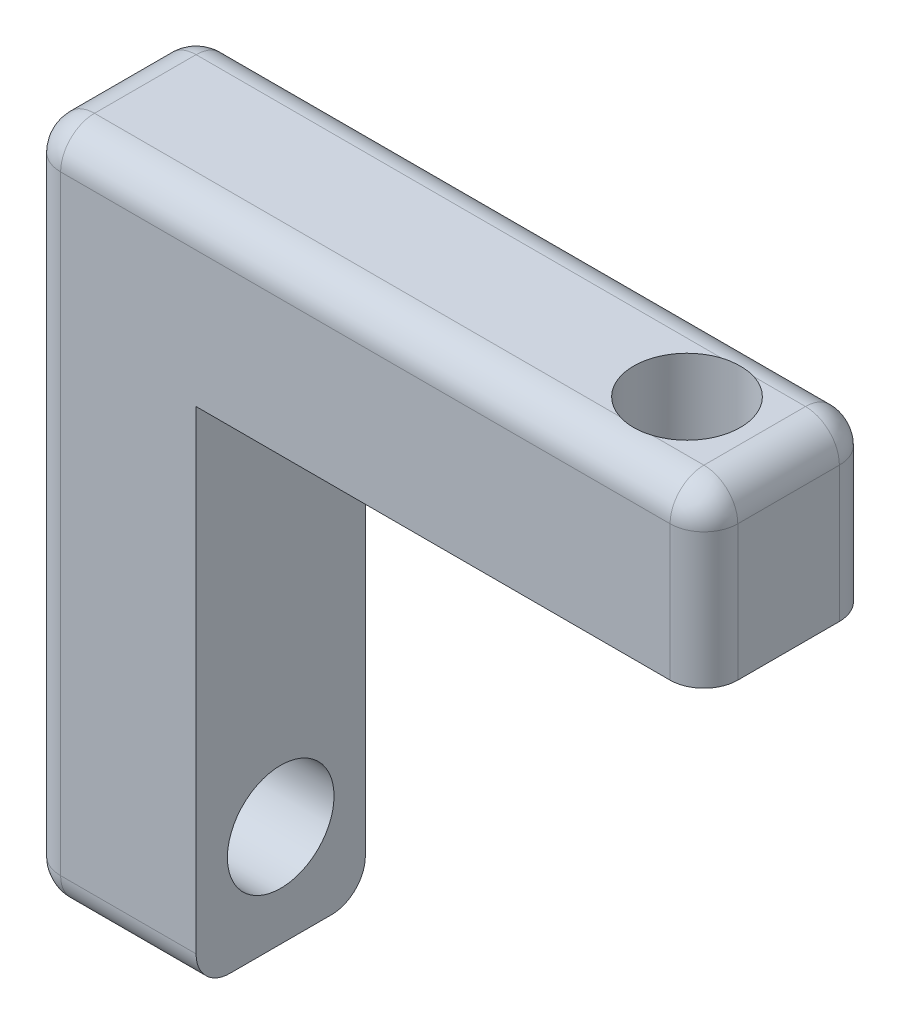
ISO-10303-21;
HEADER;
FILE_DESCRIPTION(('STEP AP214'),'2;1');
FILE_NAME('part.step','',(''),(''),'','','');
FILE_SCHEMA(('AUTOMOTIVE_DESIGN { 1 0 10303 214 1 1 1 1 }'));
ENDSEC;
DATA;
#1=APPLICATION_CONTEXT('core data for automotive mechanical design processes');
#2=APPLICATION_PROTOCOL_DEFINITION('international standard','automotive_design',2000,#1);
#3=PRODUCT_CONTEXT('',#1,'mechanical');
#4=PRODUCT('Part','Part','',(#3));
#5=PRODUCT_RELATED_PRODUCT_CATEGORY('part','',(#4));
#6=PRODUCT_DEFINITION_FORMATION('','',#4);
#7=PRODUCT_DEFINITION_CONTEXT('part definition',#1,'design');
#8=PRODUCT_DEFINITION('design','',#6,#7);
#9=PRODUCT_DEFINITION_SHAPE('','',#8);
#10=(LENGTH_UNIT() NAMED_UNIT(*) SI_UNIT(.MILLI.,.METRE.));
#11=(NAMED_UNIT(*) PLANE_ANGLE_UNIT() SI_UNIT($,.RADIAN.));
#12=(NAMED_UNIT(*) SI_UNIT($,.STERADIAN.) SOLID_ANGLE_UNIT());
#13=UNCERTAINTY_MEASURE_WITH_UNIT(LENGTH_MEASURE(1.E-05),#10,'distance_accuracy_value','');
#14=(GEOMETRIC_REPRESENTATION_CONTEXT(3) GLOBAL_UNCERTAINTY_ASSIGNED_CONTEXT((#13)) GLOBAL_UNIT_ASSIGNED_CONTEXT((#10,
#11,#12)) REPRESENTATION_CONTEXT('',''));
#15=CARTESIAN_POINT('',(0.,0.,0.));
#16=DIRECTION('',(0.,0.,1.));
#17=DIRECTION('',(1.,0.,0.));
#18=AXIS2_PLACEMENT_3D('',#15,#16,#17);
#19=CARTESIAN_POINT('',(0.,25.4,6.35));
#20=DIRECTION('',(0.,-1.,0.));
#21=DIRECTION('',(0.,0.,-1.));
#22=AXIS2_PLACEMENT_3D('',#19,#20,#21);
#23=PLANE('',#22);
#24=CARTESIAN_POINT('',(21.59,25.4,3.175));
#25=DIRECTION('',(0.,1.,0.));
#26=DIRECTION('',(0.,0.,1.));
#27=AXIS2_PLACEMENT_3D('',#24,#25,#26);
#28=CIRCLE('',#27,2.);
#29=CARTESIAN_POINT('',(20.9809228291916,25.4,1.27));
#30=VERTEX_POINT('',#29);
#31=CARTESIAN_POINT('',(20.9809228291916,25.4,5.08));
#32=VERTEX_POINT('',#31);
#33=EDGE_CURVE('E200',#30,#32,#28,.T.);
#34=ORIENTED_EDGE('',*,*,#33,.F.);
#35=DIRECTION('',(-1.,0.,0.));
#36=VECTOR('',#35,1.);
#37=CARTESIAN_POINT('',(0.,25.4,1.27));
#38=LINE('',#37,#36);
#39=CARTESIAN_POINT('',(1.27,25.4,1.27));
#40=VERTEX_POINT('',#39);
#41=EDGE_CURVE('E225',#30,#40,#38,.T.);
#42=ORIENTED_EDGE('',*,*,#41,.T.);
#43=DIRECTION('',(0.,0.,-1.));
#44=VECTOR('',#43,1.);
#45=CARTESIAN_POINT('',(1.27,25.4,6.35));
#46=LINE('',#45,#44);
#47=CARTESIAN_POINT('',(1.27,25.4,5.08));
#48=VERTEX_POINT('',#47);
#49=EDGE_CURVE('E222',#40,#48,#46,.F.);
#50=ORIENTED_EDGE('',*,*,#49,.T.);
#51=DIRECTION('',(-1.,0.,0.));
#52=VECTOR('',#51,1.);
#53=CARTESIAN_POINT('',(0.,25.4,5.08));
#54=LINE('',#53,#52);
#55=EDGE_CURVE('E220',#48,#32,#54,.F.);
#56=ORIENTED_EDGE('',*,*,#55,.T.);
#57=EDGE_LOOP('',(#34,#42,#50,#56));
#58=FACE_BOUND('',#57,.T.);
#59=ADVANCED_FACE('F36',(#58),#23,.F.);
#60=CARTESIAN_POINT('',(0.,0.,6.35));
#61=DIRECTION('',(1.,0.,0.));
#62=DIRECTION('',(0.,0.,-1.));
#63=AXIS2_PLACEMENT_3D('',#60,#61,#62);
#64=PLANE('',#63);
#65=CARTESIAN_POINT('',(0.,3.81,3.175));
#66=DIRECTION('',(-1.,0.,0.));
#67=DIRECTION('',(0.,0.,1.));
#68=AXIS2_PLACEMENT_3D('',#65,#66,#67);
#69=CIRCLE('',#68,2.);
#70=CARTESIAN_POINT('',(0.,3.20092282919157,1.27));
#71=VERTEX_POINT('',#70);
#72=CARTESIAN_POINT('',(0.,3.20092282919157,5.08));
#73=VERTEX_POINT('',#72);
#74=EDGE_CURVE('E443',#71,#73,#69,.T.);
#75=ORIENTED_EDGE('',*,*,#74,.F.);
#76=DIRECTION('',(0.,-1.,0.));
#77=VECTOR('',#76,1.);
#78=CARTESIAN_POINT('',(0.,0.,1.27));
#79=LINE('',#78,#77);
#80=CARTESIAN_POINT('',(0.,1.27,1.27));
#81=VERTEX_POINT('',#80);
#82=EDGE_CURVE('E212',#71,#81,#79,.T.);
#83=ORIENTED_EDGE('',*,*,#82,.T.);
#84=DIRECTION('',(0.,0.,-1.));
#85=VECTOR('',#84,1.);
#86=CARTESIAN_POINT('',(0.,1.27,6.35));
#87=LINE('',#86,#85);
#88=CARTESIAN_POINT('',(0.,1.27,5.08));
#89=VERTEX_POINT('',#88);
#90=EDGE_CURVE('E210',#81,#89,#87,.F.);
#91=ORIENTED_EDGE('',*,*,#90,.T.);
#92=DIRECTION('',(0.,-1.,0.));
#93=VECTOR('',#92,1.);
#94=CARTESIAN_POINT('',(0.,0.,5.08));
#95=LINE('',#94,#93);
#96=EDGE_CURVE('E208',#89,#73,#95,.F.);
#97=ORIENTED_EDGE('',*,*,#96,.T.);
#98=EDGE_LOOP('',(#75,#83,#91,#97));
#99=FACE_BOUND('',#98,.T.);
#100=ADVANCED_FACE('F317',(#99),#64,.F.);
#101=DIRECTION('',(0.,0.,-1.));
#102=VECTOR('',#101,1.);
#103=CARTESIAN_POINT('',(0.,24.13,6.35));
#104=LINE('',#103,#102);
#105=CARTESIAN_POINT('',(0.,24.13,5.08));
#106=VERTEX_POINT('',#105);
#107=CARTESIAN_POINT('',(0.,24.13,1.27));
#108=VERTEX_POINT('',#107);
#109=EDGE_CURVE('E203',#106,#108,#104,.T.);
#110=ORIENTED_EDGE('',*,*,#109,.T.);
#111=DIRECTION('',(0.,-1.,0.));
#112=VECTOR('',#111,1.);
#113=CARTESIAN_POINT('',(0.,0.,1.27));
#114=LINE('',#113,#112);
#115=CARTESIAN_POINT('',(0.,4.41907717080843,1.27));
#116=VERTEX_POINT('',#115);
#117=EDGE_CURVE('E206',#108,#116,#114,.T.);
#118=ORIENTED_EDGE('',*,*,#117,.T.);
#119=CARTESIAN_POINT('',(0.,4.41907717080843,5.08));
#120=VERTEX_POINT('',#119);
#121=EDGE_CURVE('E201',#120,#116,#69,.T.);
#122=ORIENTED_EDGE('',*,*,#121,.F.);
#123=DIRECTION('',(0.,-1.,0.));
#124=VECTOR('',#123,1.);
#125=CARTESIAN_POINT('',(0.,0.,5.08));
#126=LINE('',#125,#124);
#127=EDGE_CURVE('E196',#120,#106,#126,.F.);
#128=ORIENTED_EDGE('',*,*,#127,.T.);
#129=EDGE_LOOP('',(#110,#118,#122,#128));
#130=FACE_BOUND('',#129,.T.);
#131=ADVANCED_FACE('F324',(#130),#64,.F.);
#132=CARTESIAN_POINT('',(0.,0.,6.35));
#133=DIRECTION('',(0.,1.,0.));
#134=DIRECTION('',(0.,0.,1.));
#135=AXIS2_PLACEMENT_3D('',#132,#133,#134);
#136=PLANE('',#135);
#137=DIRECTION('',(0.,0.,-1.));
#138=VECTOR('',#137,1.);
#139=CARTESIAN_POINT('',(1.27,0.,6.35));
#140=LINE('',#139,#138);
#141=CARTESIAN_POINT('',(1.27,0.,5.08));
#142=VERTEX_POINT('',#141);
#143=CARTESIAN_POINT('',(1.27,0.,1.27));
#144=VERTEX_POINT('',#143);
#145=EDGE_CURVE('E227',#142,#144,#140,.T.);
#146=ORIENTED_EDGE('',*,*,#145,.T.);
#147=DIRECTION('',(1.,0.,0.));
#148=VECTOR('',#147,1.);
#149=CARTESIAN_POINT('',(6.35,0.,1.27));
#150=LINE('',#149,#148);
#151=CARTESIAN_POINT('',(6.35,0.,1.27));
#152=VERTEX_POINT('',#151);
#153=EDGE_CURVE('E231',#144,#152,#150,.T.);
#154=ORIENTED_EDGE('',*,*,#153,.T.);
#155=DIRECTION('',(0.,0.,-1.));
#156=VECTOR('',#155,1.);
#157=CARTESIAN_POINT('',(6.35,0.,6.35));
#158=LINE('',#157,#156);
#159=CARTESIAN_POINT('',(6.35,0.,5.08));
#160=VERTEX_POINT('',#159);
#161=EDGE_CURVE('E182',#160,#152,#158,.T.);
#162=ORIENTED_EDGE('',*,*,#161,.F.);
#163=DIRECTION('',(1.,0.,0.));
#164=VECTOR('',#163,1.);
#165=CARTESIAN_POINT('',(0.,0.,5.08));
#166=LINE('',#165,#164);
#167=EDGE_CURVE('E229',#160,#142,#166,.F.);
#168=ORIENTED_EDGE('',*,*,#167,.T.);
#169=EDGE_LOOP('',(#146,#154,#162,#168));
#170=FACE_BOUND('',#169,.T.);
#171=ADVANCED_FACE('F380',(#170),#136,.F.);
#172=CARTESIAN_POINT('',(6.35,0.,6.35));
#173=DIRECTION('',(-1.,0.,0.));
#174=DIRECTION('',(0.,0.,1.));
#175=AXIS2_PLACEMENT_3D('',#172,#173,#174);
#176=PLANE('',#175);
#177=CARTESIAN_POINT('',(6.35,3.81,3.175));
#178=DIRECTION('',(-1.,0.,0.));
#179=DIRECTION('',(0.,0.,1.));
#180=AXIS2_PLACEMENT_3D('',#177,#178,#179);
#181=CIRCLE('',#180,2.);
#182=CARTESIAN_POINT('',(6.35,3.81,5.175));
#183=VERTEX_POINT('',#182);
#184=EDGE_CURVE('E197',#183,#183,#181,.T.);
#185=ORIENTED_EDGE('',*,*,#184,.T.);
#186=EDGE_LOOP('',(#185));
#187=FACE_BOUND('',#186,.T.);
#188=ORIENTED_EDGE('',*,*,#161,.T.);
#189=CARTESIAN_POINT('',(6.35,1.27,1.27));
#190=DIRECTION('',(-1.,0.,0.));
#191=DIRECTION('',(0.,0.,1.));
#192=AXIS2_PLACEMENT_3D('',#189,#190,#191);
#193=CIRCLE('',#192,1.27);
#194=CARTESIAN_POINT('',(6.35,1.27,0.));
#195=VERTEX_POINT('',#194);
#196=EDGE_CURVE('E236',#152,#195,#193,.F.);
#197=ORIENTED_EDGE('',*,*,#196,.T.);
#198=DIRECTION('',(0.,1.,0.));
#199=VECTOR('',#198,1.);
#200=CARTESIAN_POINT('',(6.35,0.,0.));
#201=LINE('',#200,#199);
#202=CARTESIAN_POINT('',(6.35,19.05,0.));
#203=VERTEX_POINT('',#202);
#204=EDGE_CURVE('E178',#195,#203,#201,.T.);
#205=ORIENTED_EDGE('',*,*,#204,.T.);
#206=DIRECTION('',(0.,0.,-1.));
#207=VECTOR('',#206,1.);
#208=CARTESIAN_POINT('',(6.35,19.05,6.35));
#209=LINE('',#208,#207);
#210=CARTESIAN_POINT('',(6.35,19.05,6.35));
#211=VERTEX_POINT('',#210);
#212=EDGE_CURVE('E174',#211,#203,#209,.T.);
#213=ORIENTED_EDGE('',*,*,#212,.F.);
#214=DIRECTION('',(0.,1.,0.));
#215=VECTOR('',#214,1.);
#216=CARTESIAN_POINT('',(6.35,0.,6.35));
#217=LINE('',#216,#215);
#218=CARTESIAN_POINT('',(6.35,1.27,6.35));
#219=VERTEX_POINT('',#218);
#220=EDGE_CURVE('E161',#219,#211,#217,.T.);
#221=ORIENTED_EDGE('',*,*,#220,.F.);
#222=CARTESIAN_POINT('',(6.35,1.27,5.08));
#223=DIRECTION('',(-1.,0.,0.));
#224=DIRECTION('',(0.,0.,1.));
#225=AXIS2_PLACEMENT_3D('',#222,#223,#224);
#226=CIRCLE('',#225,1.27);
#227=EDGE_CURVE('E234',#219,#160,#226,.F.);
#228=ORIENTED_EDGE('',*,*,#227,.T.);
#229=EDGE_LOOP('',(#188,#197,#205,#213,#221,#228));
#230=FACE_BOUND('',#229,.T.);
#231=ADVANCED_FACE('F176',(#187,#230),#176,.F.);
#232=CARTESIAN_POINT('',(6.35,19.05,6.35));
#233=DIRECTION('',(0.,1.,0.));
#234=DIRECTION('',(0.,0.,1.));
#235=AXIS2_PLACEMENT_3D('',#232,#233,#234);
#236=PLANE('',#235);
#237=CARTESIAN_POINT('',(21.59,19.05,3.175));
#238=DIRECTION('',(0.,1.,0.));
#239=DIRECTION('',(0.,0.,1.));
#240=AXIS2_PLACEMENT_3D('',#237,#238,#239);
#241=CIRCLE('',#240,2.);
#242=CARTESIAN_POINT('',(21.59,19.05,5.175));
#243=VERTEX_POINT('',#242);
#244=EDGE_CURVE('E193',#243,#243,#241,.T.);
#245=ORIENTED_EDGE('',*,*,#244,.T.);
#246=EDGE_LOOP('',(#245));
#247=FACE_BOUND('',#246,.T.);
#248=DIRECTION('',(1.,0.,0.));
#249=VECTOR('',#248,1.);
#250=CARTESIAN_POINT('',(6.35,19.05,0.));
#251=LINE('',#250,#249);
#252=CARTESIAN_POINT('',(24.13,19.05,0.));
#253=VERTEX_POINT('',#252);
#254=EDGE_CURVE('E171',#203,#253,#251,.T.);
#255=ORIENTED_EDGE('',*,*,#254,.T.);
#256=CARTESIAN_POINT('',(24.13,19.05,1.27));
#257=DIRECTION('',(0.,1.,0.));
#258=DIRECTION('',(0.,0.,1.));
#259=AXIS2_PLACEMENT_3D('',#256,#257,#258);
#260=CIRCLE('',#259,1.27);
#261=CARTESIAN_POINT('',(25.4,19.05,1.27));
#262=VERTEX_POINT('',#261);
#263=EDGE_CURVE('E11',#253,#262,#260,.F.);
#264=ORIENTED_EDGE('',*,*,#263,.T.);
#265=DIRECTION('',(0.,0.,-1.));
#266=VECTOR('',#265,1.);
#267=CARTESIAN_POINT('',(25.4,19.05,6.35));
#268=LINE('',#267,#266);
#269=CARTESIAN_POINT('',(25.4,19.05,5.08));
#270=VERTEX_POINT('',#269);
#271=EDGE_CURVE('E183',#270,#262,#268,.T.);
#272=ORIENTED_EDGE('',*,*,#271,.F.);
#273=CARTESIAN_POINT('',(24.13,19.05,5.08));
#274=DIRECTION('',(0.,1.,0.));
#275=DIRECTION('',(0.,0.,1.));
#276=AXIS2_PLACEMENT_3D('',#273,#274,#275);
#277=CIRCLE('',#276,1.27);
#278=CARTESIAN_POINT('',(24.13,19.05,6.35));
#279=VERTEX_POINT('',#278);
#280=EDGE_CURVE('E45',#270,#279,#277,.F.);
#281=ORIENTED_EDGE('',*,*,#280,.T.);
#282=DIRECTION('',(1.,0.,0.));
#283=VECTOR('',#282,1.);
#284=CARTESIAN_POINT('',(6.35,19.05,6.35));
#285=LINE('',#284,#283);
#286=EDGE_CURVE('E165',#211,#279,#285,.T.);
#287=ORIENTED_EDGE('',*,*,#286,.F.);
#288=ORIENTED_EDGE('',*,*,#212,.T.);
#289=EDGE_LOOP('',(#255,#264,#272,#281,#287,#288));
#290=FACE_BOUND('',#289,.T.);
#291=ADVANCED_FACE('F185',(#247,#290),#236,.F.);
#292=CARTESIAN_POINT('',(25.4,25.4,6.35));
#293=DIRECTION('',(-1.,0.,0.));
#294=DIRECTION('',(0.,0.,1.));
#295=AXIS2_PLACEMENT_3D('',#292,#293,#294);
#296=PLANE('',#295);
#297=ORIENTED_EDGE('',*,*,#271,.T.);
#298=DIRECTION('',(0.,1.,0.));
#299=VECTOR('',#298,1.);
#300=CARTESIAN_POINT('',(25.4,25.4,1.27));
#301=LINE('',#300,#299);
#302=CARTESIAN_POINT('',(25.4,24.13,1.27));
#303=VERTEX_POINT('',#302);
#304=EDGE_CURVE('E58',#262,#303,#301,.T.);
#305=ORIENTED_EDGE('',*,*,#304,.T.);
#306=DIRECTION('',(0.,0.,-1.));
#307=VECTOR('',#306,1.);
#308=CARTESIAN_POINT('',(25.4,24.13,6.35));
#309=LINE('',#308,#307);
#310=CARTESIAN_POINT('',(25.4,24.13,5.08));
#311=VERTEX_POINT('',#310);
#312=EDGE_CURVE('E53',#303,#311,#309,.F.);
#313=ORIENTED_EDGE('',*,*,#312,.T.);
#314=DIRECTION('',(0.,1.,0.));
#315=VECTOR('',#314,1.);
#316=CARTESIAN_POINT('',(25.4,25.4,5.08));
#317=LINE('',#316,#315);
#318=EDGE_CURVE('E503',#311,#270,#317,.F.);
#319=ORIENTED_EDGE('',*,*,#318,.T.);
#320=EDGE_LOOP('',(#297,#305,#313,#319));
#321=FACE_BOUND('',#320,.T.);
#322=ADVANCED_FACE('F330',(#321),#296,.F.);
#323=DIRECTION('',(0.,0.,-1.));
#324=VECTOR('',#323,1.);
#325=CARTESIAN_POINT('',(24.13,25.4,6.35));
#326=LINE('',#325,#324);
#327=CARTESIAN_POINT('',(24.13,25.4,5.08));
#328=VERTEX_POINT('',#327);
#329=CARTESIAN_POINT('',(24.13,25.4,1.27));
#330=VERTEX_POINT('',#329);
#331=EDGE_CURVE('E214',#328,#330,#326,.T.);
#332=ORIENTED_EDGE('',*,*,#331,.T.);
#333=DIRECTION('',(-1.,0.,0.));
#334=VECTOR('',#333,1.);
#335=CARTESIAN_POINT('',(0.,25.4,1.27));
#336=LINE('',#335,#334);
#337=CARTESIAN_POINT('',(22.1990771708084,25.4,1.27));
#338=VERTEX_POINT('',#337);
#339=EDGE_CURVE('E218',#330,#338,#336,.T.);
#340=ORIENTED_EDGE('',*,*,#339,.T.);
#341=CARTESIAN_POINT('',(22.1990771708084,25.4,5.08));
#342=VERTEX_POINT('',#341);
#343=EDGE_CURVE('E368',#342,#338,#28,.T.);
#344=ORIENTED_EDGE('',*,*,#343,.F.);
#345=DIRECTION('',(-1.,0.,0.));
#346=VECTOR('',#345,1.);
#347=CARTESIAN_POINT('',(0.,25.4,5.08));
#348=LINE('',#347,#346);
#349=EDGE_CURVE('E216',#342,#328,#348,.F.);
#350=ORIENTED_EDGE('',*,*,#349,.T.);
#351=EDGE_LOOP('',(#332,#340,#344,#350));
#352=FACE_BOUND('',#351,.T.);
#353=ADVANCED_FACE('F320',(#352),#23,.F.);
#354=CARTESIAN_POINT('',(0.,0.,6.35));
#355=DIRECTION('',(0.,0.,-1.));
#356=DIRECTION('',(-1.,0.,0.));
#357=AXIS2_PLACEMENT_3D('',#354,#355,#356);
#358=PLANE('',#357);
#359=DIRECTION('',(0.,-1.,0.));
#360=VECTOR('',#359,1.);
#361=CARTESIAN_POINT('',(1.27,0.,6.35));
#362=LINE('',#361,#360);
#363=CARTESIAN_POINT('',(1.27,24.13,6.35));
#364=VERTEX_POINT('',#363);
#365=CARTESIAN_POINT('',(1.27,1.27,6.35));
#366=VERTEX_POINT('',#365);
#367=EDGE_CURVE('E250',#364,#366,#362,.T.);
#368=ORIENTED_EDGE('',*,*,#367,.T.);
#369=DIRECTION('',(1.,0.,0.));
#370=VECTOR('',#369,1.);
#371=CARTESIAN_POINT('',(0.,1.27,6.35));
#372=LINE('',#371,#370);
#373=EDGE_CURVE('E168',#366,#219,#372,.T.);
#374=ORIENTED_EDGE('',*,*,#373,.T.);
#375=ORIENTED_EDGE('',*,*,#220,.T.);
#376=ORIENTED_EDGE('',*,*,#286,.T.);
#377=DIRECTION('',(0.,1.,0.));
#378=VECTOR('',#377,1.);
#379=CARTESIAN_POINT('',(24.13,0.,6.35));
#380=LINE('',#379,#378);
#381=CARTESIAN_POINT('',(24.13,24.13,6.35));
#382=VERTEX_POINT('',#381);
#383=EDGE_CURVE('E246',#279,#382,#380,.T.);
#384=ORIENTED_EDGE('',*,*,#383,.T.);
#385=DIRECTION('',(-1.,0.,0.));
#386=VECTOR('',#385,1.);
#387=CARTESIAN_POINT('',(0.,24.13,6.35));
#388=LINE('',#387,#386);
#389=EDGE_CURVE('E248',#382,#364,#388,.T.);
#390=ORIENTED_EDGE('',*,*,#389,.T.);
#391=EDGE_LOOP('',(#368,#374,#375,#376,#384,#390));
#392=FACE_BOUND('',#391,.T.);
#393=ADVANCED_FACE('F163',(#392),#358,.F.);
#394=CARTESIAN_POINT('',(0.,0.,0.));
#395=DIRECTION('',(0.,0.,-1.));
#396=DIRECTION('',(-1.,0.,0.));
#397=AXIS2_PLACEMENT_3D('',#394,#395,#396);
#398=PLANE('',#397);
#399=ORIENTED_EDGE('',*,*,#204,.F.);
#400=DIRECTION('',(1.,0.,0.));
#401=VECTOR('',#400,1.);
#402=CARTESIAN_POINT('',(0.,1.27,0.));
#403=LINE('',#402,#401);
#404=CARTESIAN_POINT('',(1.27,1.27,0.));
#405=VERTEX_POINT('',#404);
#406=EDGE_CURVE('E244',#195,#405,#403,.F.);
#407=ORIENTED_EDGE('',*,*,#406,.T.);
#408=DIRECTION('',(0.,-1.,0.));
#409=VECTOR('',#408,1.);
#410=CARTESIAN_POINT('',(1.27,25.4,0.));
#411=LINE('',#410,#409);
#412=CARTESIAN_POINT('',(1.27,24.13,0.));
#413=VERTEX_POINT('',#412);
#414=EDGE_CURVE('E242',#405,#413,#411,.F.);
#415=ORIENTED_EDGE('',*,*,#414,.T.);
#416=DIRECTION('',(-1.,0.,0.));
#417=VECTOR('',#416,1.);
#418=CARTESIAN_POINT('',(25.4,24.13,0.));
#419=LINE('',#418,#417);
#420=CARTESIAN_POINT('',(24.13,24.13,0.));
#421=VERTEX_POINT('',#420);
#422=EDGE_CURVE('E240',#413,#421,#419,.F.);
#423=ORIENTED_EDGE('',*,*,#422,.T.);
#424=DIRECTION('',(0.,1.,0.));
#425=VECTOR('',#424,1.);
#426=CARTESIAN_POINT('',(24.13,19.05,0.));
#427=LINE('',#426,#425);
#428=EDGE_CURVE('E238',#421,#253,#427,.F.);
#429=ORIENTED_EDGE('',*,*,#428,.T.);
#430=ORIENTED_EDGE('',*,*,#254,.F.);
#431=EDGE_LOOP('',(#399,#407,#415,#423,#429,#430));
#432=FACE_BOUND('',#431,.T.);
#433=ADVANCED_FACE('F281',(#432),#398,.T.);
#434=CARTESIAN_POINT('',(21.59,0.,3.175));
#435=DIRECTION('',(0.,1.,0.));
#436=DIRECTION('',(0.,0.,1.));
#437=AXIS2_PLACEMENT_3D('',#434,#435,#436);
#438=CYLINDRICAL_SURFACE('',#437,2.);
#439=ORIENTED_EDGE('',*,*,#343,.T.);
#440=CARTESIAN_POINT('',(22.1990771708084,25.4,1.27));
#441=CARTESIAN_POINT('',(22.1471523779685,25.3999777083239,1.25339273943028));
#442=CARTESIAN_POINT('',(22.0945475353826,25.3996732791012,1.23891909818287));
#443=CARTESIAN_POINT('',(21.9883326612448,25.398844236318,1.21431206721416));
#444=CARTESIAN_POINT('',(21.9347226112134,25.398319618706,1.20417875736618));
#445=CARTESIAN_POINT('',(21.8281684489539,25.3974055900217,1.18851916990609));
#446=CARTESIAN_POINT('',(21.775239943129,25.3970131957339,1.18288664452793));
#447=CARTESIAN_POINT('',(21.6691055338617,25.3965113056142,1.17585772985994));
#448=CARTESIAN_POINT('',(21.6158996626074,25.3964017776572,1.17446085952549));
#449=CARTESIAN_POINT('',(21.5139834354934,25.3965053262664,1.17585066745369));
#450=CARTESIAN_POINT('',(21.4652680983623,25.3966922686149,1.17829827282784));
#451=CARTESIAN_POINT('',(21.3681477984559,25.397275010721,1.18674508256253));
#452=CARTESIAN_POINT('',(21.3197428308608,25.3976708072273,1.19274423163521));
#453=CARTESIAN_POINT('',(21.2223989724441,25.3985331696052,1.208440994344));
#454=CARTESIAN_POINT('',(21.1734732255161,25.3990011481189,1.21822012971506));
#455=CARTESIAN_POINT('',(21.076483067899,25.3997268478861,1.24140473355245));
#456=CARTESIAN_POINT('',(21.0284187282127,25.3999845518847,1.2548104994965));
#457=CARTESIAN_POINT('',(20.9809228291916,25.4,1.27));
#458=B_SPLINE_CURVE_WITH_KNOTS('',3,(#440,#441,#442,#443,#444,#445,#446,#447,#448,#449,#450,
#451,#452,#453,#454,#455,#456,#457),.UNSPECIFIED.,.F.,.F.,(4,2,2,2,2,2,2,2,4),(0.,
0.163499357334249,0.327001723349681,0.486519833575763,0.646019826603368,0.792222326662493,
0.938422550807315,1.0879696033031,1.23752892625525),.UNSPECIFIED.);
#459=EDGE_CURVE('E291',#338,#30,#458,.T.);
#460=ORIENTED_EDGE('',*,*,#459,.T.);
#461=ORIENTED_EDGE('',*,*,#33,.T.);
#462=CARTESIAN_POINT('',(20.9809228291916,25.4,5.08));
#463=CARTESIAN_POINT('',(21.0328476220315,25.3999777083239,5.09660726056972));
#464=CARTESIAN_POINT('',(21.0854524646174,25.3996732791012,5.11108090181713));
#465=CARTESIAN_POINT('',(21.1916673387552,25.398844236318,5.13568793278584));
#466=CARTESIAN_POINT('',(21.2452773887866,25.398319618706,5.14582124263382));
#467=CARTESIAN_POINT('',(21.3518315510461,25.3974055900217,5.16148083009391));
#468=CARTESIAN_POINT('',(21.404760056871,25.3970131957339,5.16711335547207));
#469=CARTESIAN_POINT('',(21.5108944661383,25.3965113056142,5.17414227014006));
#470=CARTESIAN_POINT('',(21.5641003373926,25.3964017776572,5.17553914047451));
#471=CARTESIAN_POINT('',(21.6660165645066,25.3965053262664,5.17414933254631));
#472=CARTESIAN_POINT('',(21.7147319016377,25.3966922686149,5.17170172717216));
#473=CARTESIAN_POINT('',(21.8118522015441,25.397275010721,5.16325491743747));
#474=CARTESIAN_POINT('',(21.8602571691391,25.3976708072273,5.15725576836479));
#475=CARTESIAN_POINT('',(21.9576010275559,25.3985331696052,5.141559005656));
#476=CARTESIAN_POINT('',(22.0065267744839,25.3990011481189,5.13177987028494));
#477=CARTESIAN_POINT('',(22.103516932101,25.3997268478861,5.10859526644755));
#478=CARTESIAN_POINT('',(22.1515812717873,25.3999845518847,5.0951895005035));
#479=CARTESIAN_POINT('',(22.1990771708084,25.4,5.08));
#480=B_SPLINE_CURVE_WITH_KNOTS('',3,(#462,#463,#464,#465,#466,#467,#468,#469,#470,#471,#472,
#473,#474,#475,#476,#477,#478,#479),.UNSPECIFIED.,.F.,.F.,(4,2,2,2,2,2,2,2,4),(0.,
0.163499357334249,0.327001723349682,0.486519833575763,0.646019826603368,0.792222326662493,
0.938422550807315,1.08796960330311,1.23752892625525),.UNSPECIFIED.);
#481=EDGE_CURVE('E285',#32,#342,#480,.T.);
#482=ORIENTED_EDGE('',*,*,#481,.T.);
#483=EDGE_LOOP('',(#439,#460,#461,#482));
#484=FACE_BOUND('',#483,.T.);
#485=ORIENTED_EDGE('',*,*,#244,.F.);
#486=EDGE_LOOP('',(#485));
#487=FACE_BOUND('',#486,.T.);
#488=ADVANCED_FACE('F275',(#484,#487),#438,.F.);
#489=CARTESIAN_POINT('',(25.4,3.81,3.175));
#490=DIRECTION('',(-1.,0.,0.));
#491=DIRECTION('',(0.,0.,1.));
#492=AXIS2_PLACEMENT_3D('',#489,#490,#491);
#493=CYLINDRICAL_SURFACE('',#492,2.);
#494=ORIENTED_EDGE('',*,*,#121,.T.);
#495=CARTESIAN_POINT('',(0.,4.41907717080843,1.27));
#496=CARTESIAN_POINT('',(2.22916760788833E-05,4.36715237796849,1.25339273943028));
#497=CARTESIAN_POINT('',(0.000326720898841675,4.3145475353826,1.23891909818287));
#498=CARTESIAN_POINT('',(0.00115576368196632,4.2083326612448,1.21431206721416));
#499=CARTESIAN_POINT('',(0.00168038129401149,4.15472261121343,1.20417875736618));
#500=CARTESIAN_POINT('',(0.00259440997829252,4.04816844895392,1.18851916990609));
#501=CARTESIAN_POINT('',(0.00298680426606155,3.99523994312903,1.18288664452793));
#502=CARTESIAN_POINT('',(0.00348869438583588,3.88910553386176,1.17585772985994));
#503=CARTESIAN_POINT('',(0.00359822234284599,3.83589966260741,1.17446085952549));
#504=CARTESIAN_POINT('',(0.00349467373355291,3.7339834354934,1.17585066745369));
#505=CARTESIAN_POINT('',(0.00330773138513183,3.68526809836234,1.17829827282784));
#506=CARTESIAN_POINT('',(0.00272498927903267,3.58814779845594,1.18674508256252));
#507=CARTESIAN_POINT('',(0.00232919277265458,3.53974283086085,1.1927442316352));
#508=CARTESIAN_POINT('',(0.00146683039484285,3.44239897244412,1.208440994344));
#509=CARTESIAN_POINT('',(0.00099885188113921,3.39347322551606,1.21822012971506));
#510=CARTESIAN_POINT('',(0.000273152113886076,3.29648306789897,1.24140473355245));
#511=CARTESIAN_POINT('',(1.54481152650877E-05,3.24841872821265,1.2548104994965));
#512=CARTESIAN_POINT('',(0.,3.20092282919157,1.27));
#513=B_SPLINE_CURVE_WITH_KNOTS('',3,(#495,#496,#497,#498,#499,#500,#501,#502,#503,#504,#505,
#506,#507,#508,#509,#510,#511,#512),.UNSPECIFIED.,.F.,.F.,(4,2,2,2,2,2,2,2,4),(0.,
0.163499357334247,0.32700172334968,0.486519833575758,0.646019826603365,0.792222326662491,
0.938422550807319,1.08796960330311,1.23752892625527),.UNSPECIFIED.);
#514=EDGE_CURVE('E261',#116,#71,#513,.T.);
#515=ORIENTED_EDGE('',*,*,#514,.T.);
#516=ORIENTED_EDGE('',*,*,#74,.T.);
#517=CARTESIAN_POINT('',(0.,3.20092282919157,5.08));
#518=CARTESIAN_POINT('',(2.22916760788971E-05,3.25284762203151,5.09660726056972));
#519=CARTESIAN_POINT('',(0.000326720898841703,3.30545246461739,5.11108090181713));
#520=CARTESIAN_POINT('',(0.00115576368196636,3.41166733875519,5.13568793278584));
#521=CARTESIAN_POINT('',(0.00168038129401154,3.46527738878657,5.14582124263382));
#522=CARTESIAN_POINT('',(0.00259440997829255,3.57183155104608,5.16148083009391));
#523=CARTESIAN_POINT('',(0.00298680426606155,3.62476005687096,5.16711335547206));
#524=CARTESIAN_POINT('',(0.00348869438583582,3.73089446613824,5.17414227014006));
#525=CARTESIAN_POINT('',(0.0035982223428459,3.78410033739259,5.17553914047451));
#526=CARTESIAN_POINT('',(0.00349467373355291,3.8860165645066,5.17414933254631));
#527=CARTESIAN_POINT('',(0.00330773138513194,3.93473190163766,5.17170172717216));
#528=CARTESIAN_POINT('',(0.00272498927903274,4.03185220154405,5.16325491743747));
#529=CARTESIAN_POINT('',(0.00232919277265449,4.08025716913914,5.1572557683648));
#530=CARTESIAN_POINT('',(0.00146683039484276,4.17760102755588,5.141559005656));
#531=CARTESIAN_POINT('',(0.000998851881139266,4.22652677448394,5.13177987028494));
#532=CARTESIAN_POINT('',(0.000273152113886272,4.32351693210103,5.10859526644755));
#533=CARTESIAN_POINT('',(1.54481152652731E-05,4.37158127178735,5.0951895005035));
#534=CARTESIAN_POINT('',(0.,4.41907717080843,5.08));
#535=B_SPLINE_CURVE_WITH_KNOTS('',3,(#517,#518,#519,#520,#521,#522,#523,#524,#525,#526,#527,
#528,#529,#530,#531,#532,#533,#534),.UNSPECIFIED.,.F.,.F.,(4,2,2,2,2,2,2,2,4),(0.,
0.163499357334246,0.327001723349679,0.486519833575757,0.646019826603365,0.792222326662492,
0.938422550807319,1.08796960330311,1.23752892625526),.UNSPECIFIED.);
#536=EDGE_CURVE('E253',#73,#120,#535,.T.);
#537=ORIENTED_EDGE('',*,*,#536,.T.);
#538=EDGE_LOOP('',(#494,#515,#516,#537));
#539=FACE_BOUND('',#538,.T.);
#540=ORIENTED_EDGE('',*,*,#184,.F.);
#541=EDGE_LOOP('',(#540));
#542=FACE_BOUND('',#541,.T.);
#543=ADVANCED_FACE('F271',(#539,#542),#493,.F.);
#544=CARTESIAN_POINT('',(24.13,0.,5.08));
#545=DIRECTION('',(0.,1.,0.));
#546=DIRECTION('',(0.,0.,1.));
#547=AXIS2_PLACEMENT_3D('',#544,#545,#546);
#548=CYLINDRICAL_SURFACE('',#547,1.27);
#549=ORIENTED_EDGE('',*,*,#280,.F.);
#550=ORIENTED_EDGE('',*,*,#318,.F.);
#551=CARTESIAN_POINT('',(24.13,24.13,5.08));
#552=DIRECTION('',(0.,1.,0.));
#553=DIRECTION('',(0.,0.,1.));
#554=AXIS2_PLACEMENT_3D('',#551,#552,#553);
#555=CIRCLE('',#554,1.27);
#556=EDGE_CURVE('E438',#382,#311,#555,.T.);
#557=ORIENTED_EDGE('',*,*,#556,.F.);
#558=ORIENTED_EDGE('',*,*,#383,.F.);
#559=EDGE_LOOP('',(#549,#550,#557,#558));
#560=FACE_BOUND('',#559,.T.);
#561=ADVANCED_FACE('F38',(#560),#548,.T.);
#562=CARTESIAN_POINT('',(0.,1.27,5.08));
#563=DIRECTION('',(1.,0.,0.));
#564=DIRECTION('',(0.,0.,-1.));
#565=AXIS2_PLACEMENT_3D('',#562,#563,#564);
#566=CYLINDRICAL_SURFACE('',#565,1.27);
#567=ORIENTED_EDGE('',*,*,#227,.F.);
#568=ORIENTED_EDGE('',*,*,#373,.F.);
#569=CARTESIAN_POINT('',(1.27,1.27,5.08));
#570=DIRECTION('',(-1.,0.,0.));
#571=DIRECTION('',(0.,0.,1.));
#572=AXIS2_PLACEMENT_3D('',#569,#570,#571);
#573=CIRCLE('',#572,1.27);
#574=EDGE_CURVE('E436',#142,#366,#573,.T.);
#575=ORIENTED_EDGE('',*,*,#574,.F.);
#576=ORIENTED_EDGE('',*,*,#167,.F.);
#577=EDGE_LOOP('',(#567,#568,#575,#576));
#578=FACE_BOUND('',#577,.T.);
#579=ADVANCED_FACE('F479',(#578),#566,.T.);
#580=CARTESIAN_POINT('',(1.27,1.27,6.35));
#581=DIRECTION('',(0.,0.,-1.));
#582=DIRECTION('',(-1.,0.,0.));
#583=AXIS2_PLACEMENT_3D('',#580,#581,#582);
#584=CYLINDRICAL_SURFACE('',#583,1.27);
#585=CARTESIAN_POINT('',(1.27,1.27,1.27));
#586=DIRECTION('',(0.,0.,-1.));
#587=DIRECTION('',(-1.,0.,0.));
#588=AXIS2_PLACEMENT_3D('',#585,#586,#587);
#589=CIRCLE('',#588,1.27);
#590=EDGE_CURVE('E430',#144,#81,#589,.T.);
#591=ORIENTED_EDGE('',*,*,#590,.F.);
#592=ORIENTED_EDGE('',*,*,#145,.F.);
#593=CARTESIAN_POINT('',(1.27,1.27,5.08));
#594=DIRECTION('',(0.,0.,1.));
#595=DIRECTION('',(1.,0.,0.));
#596=AXIS2_PLACEMENT_3D('',#593,#594,#595);
#597=CIRCLE('',#596,1.27);
#598=EDGE_CURVE('E433',#89,#142,#597,.T.);
#599=ORIENTED_EDGE('',*,*,#598,.F.);
#600=ORIENTED_EDGE('',*,*,#90,.F.);
#601=EDGE_LOOP('',(#591,#592,#599,#600));
#602=FACE_BOUND('',#601,.T.);
#603=ADVANCED_FACE('F476',(#602),#584,.T.);
#604=CARTESIAN_POINT('',(0.,1.27,1.27));
#605=DIRECTION('',(-1.,0.,0.));
#606=DIRECTION('',(0.,0.,1.));
#607=AXIS2_PLACEMENT_3D('',#604,#605,#606);
#608=CYLINDRICAL_SURFACE('',#607,1.27);
#609=ORIENTED_EDGE('',*,*,#196,.F.);
#610=ORIENTED_EDGE('',*,*,#153,.F.);
#611=CARTESIAN_POINT('',(1.27,1.27,1.27));
#612=DIRECTION('',(-1.,0.,0.));
#613=DIRECTION('',(0.,0.,1.));
#614=AXIS2_PLACEMENT_3D('',#611,#612,#613);
#615=CIRCLE('',#614,1.27);
#616=EDGE_CURVE('E427',#405,#144,#615,.T.);
#617=ORIENTED_EDGE('',*,*,#616,.F.);
#618=ORIENTED_EDGE('',*,*,#406,.F.);
#619=EDGE_LOOP('',(#609,#610,#617,#618));
#620=FACE_BOUND('',#619,.T.);
#621=ADVANCED_FACE('F472',(#620),#608,.T.);
#622=CARTESIAN_POINT('',(24.13,25.4,1.27));
#623=DIRECTION('',(0.,-1.,0.));
#624=DIRECTION('',(0.,0.,-1.));
#625=AXIS2_PLACEMENT_3D('',#622,#623,#624);
#626=CYLINDRICAL_SURFACE('',#625,1.27);
#627=ORIENTED_EDGE('',*,*,#263,.F.);
#628=ORIENTED_EDGE('',*,*,#428,.F.);
#629=CARTESIAN_POINT('',(24.13,24.13,1.27));
#630=DIRECTION('',(0.,1.,0.));
#631=DIRECTION('',(0.,0.,1.));
#632=AXIS2_PLACEMENT_3D('',#629,#630,#631);
#633=CIRCLE('',#632,1.27);
#634=EDGE_CURVE('E352',#303,#421,#633,.T.);
#635=ORIENTED_EDGE('',*,*,#634,.F.);
#636=ORIENTED_EDGE('',*,*,#304,.F.);
#637=EDGE_LOOP('',(#627,#628,#635,#636));
#638=FACE_BOUND('',#637,.T.);
#639=ADVANCED_FACE('F466',(#638),#626,.T.);
#640=CARTESIAN_POINT('',(24.13,24.13,6.35));
#641=DIRECTION('',(0.,0.,-1.));
#642=DIRECTION('',(-1.,0.,0.));
#643=AXIS2_PLACEMENT_3D('',#640,#641,#642);
#644=CYLINDRICAL_SURFACE('',#643,1.27);
#645=CARTESIAN_POINT('',(24.13,24.13,5.08));
#646=DIRECTION('',(0.,0.,1.));
#647=DIRECTION('',(1.,0.,0.));
#648=AXIS2_PLACEMENT_3D('',#645,#646,#647);
#649=CIRCLE('',#648,1.27);
#650=EDGE_CURVE('E40',#311,#328,#649,.T.);
#651=ORIENTED_EDGE('',*,*,#650,.F.);
#652=ORIENTED_EDGE('',*,*,#312,.F.);
#653=CARTESIAN_POINT('',(24.13,24.13,1.27));
#654=DIRECTION('',(0.,0.,-1.));
#655=DIRECTION('',(-1.,0.,0.));
#656=AXIS2_PLACEMENT_3D('',#653,#654,#655);
#657=CIRCLE('',#656,1.27);
#658=EDGE_CURVE('E346',#330,#303,#657,.T.);
#659=ORIENTED_EDGE('',*,*,#658,.F.);
#660=ORIENTED_EDGE('',*,*,#331,.F.);
#661=EDGE_LOOP('',(#651,#652,#659,#660));
#662=FACE_BOUND('',#661,.T.);
#663=ADVANCED_FACE('F348',(#662),#644,.T.);
#664=CARTESIAN_POINT('',(24.13,24.13,5.08));
#665=DIRECTION('',(0.,0.,1.));
#666=DIRECTION('',(1.,0.,0.));
#667=AXIS2_PLACEMENT_3D('',#664,#665,#666);
#668=SPHERICAL_SURFACE('',#667,1.27);
#669=ORIENTED_EDGE('',*,*,#556,.T.);
#670=ORIENTED_EDGE('',*,*,#650,.T.);
#671=CARTESIAN_POINT('',(24.13,24.13,5.08));
#672=DIRECTION('',(1.,0.,0.));
#673=DIRECTION('',(0.,0.,-1.));
#674=AXIS2_PLACEMENT_3D('',#671,#672,#673);
#675=CIRCLE('',#674,1.27);
#676=EDGE_CURVE('E353',#382,#328,#675,.F.);
#677=ORIENTED_EDGE('',*,*,#676,.F.);
#678=EDGE_LOOP('',(#669,#670,#677));
#679=FACE_BOUND('',#678,.T.);
#680=ADVANCED_FACE('F455',(#679),#668,.T.);
#681=CARTESIAN_POINT('',(1.27,1.27,5.08));
#682=DIRECTION('',(0.,0.,1.));
#683=DIRECTION('',(1.,0.,0.));
#684=AXIS2_PLACEMENT_3D('',#681,#682,#683);
#685=SPHERICAL_SURFACE('',#684,1.27);
#686=ORIENTED_EDGE('',*,*,#598,.T.);
#687=ORIENTED_EDGE('',*,*,#574,.T.);
#688=CARTESIAN_POINT('',(1.27,1.27,5.08));
#689=DIRECTION('',(0.,-1.,0.));
#690=DIRECTION('',(0.,0.,-1.));
#691=AXIS2_PLACEMENT_3D('',#688,#689,#690);
#692=CIRCLE('',#691,1.27);
#693=EDGE_CURVE('E421',#89,#366,#692,.F.);
#694=ORIENTED_EDGE('',*,*,#693,.F.);
#695=EDGE_LOOP('',(#686,#687,#694));
#696=FACE_BOUND('',#695,.T.);
#697=ADVANCED_FACE('F457',(#696),#685,.T.);
#698=CARTESIAN_POINT('',(1.27,1.27,1.27));
#699=DIRECTION('',(0.,0.,1.));
#700=DIRECTION('',(1.,0.,0.));
#701=AXIS2_PLACEMENT_3D('',#698,#699,#700);
#702=SPHERICAL_SURFACE('',#701,1.27);
#703=ORIENTED_EDGE('',*,*,#616,.T.);
#704=ORIENTED_EDGE('',*,*,#590,.T.);
#705=CARTESIAN_POINT('',(1.27,1.27,1.27));
#706=DIRECTION('',(0.,-1.,0.));
#707=DIRECTION('',(0.,0.,-1.));
#708=AXIS2_PLACEMENT_3D('',#705,#706,#707);
#709=CIRCLE('',#708,1.27);
#710=EDGE_CURVE('E359',#405,#81,#709,.F.);
#711=ORIENTED_EDGE('',*,*,#710,.F.);
#712=EDGE_LOOP('',(#703,#704,#711));
#713=FACE_BOUND('',#712,.T.);
#714=ADVANCED_FACE('F463',(#713),#702,.T.);
#715=CARTESIAN_POINT('',(24.13,24.13,1.27));
#716=DIRECTION('',(0.,0.,1.));
#717=DIRECTION('',(1.,0.,0.));
#718=AXIS2_PLACEMENT_3D('',#715,#716,#717);
#719=SPHERICAL_SURFACE('',#718,1.27);
#720=ORIENTED_EDGE('',*,*,#658,.T.);
#721=ORIENTED_EDGE('',*,*,#634,.T.);
#722=CARTESIAN_POINT('',(24.13,24.13,1.27));
#723=DIRECTION('',(1.,0.,0.));
#724=DIRECTION('',(0.,0.,-1.));
#725=AXIS2_PLACEMENT_3D('',#722,#723,#724);
#726=CIRCLE('',#725,1.27);
#727=EDGE_CURVE('E356',#330,#421,#726,.F.);
#728=ORIENTED_EDGE('',*,*,#727,.F.);
#729=EDGE_LOOP('',(#720,#721,#728));
#730=FACE_BOUND('',#729,.T.);
#731=ADVANCED_FACE('F357',(#730),#719,.T.);
#732=CARTESIAN_POINT('',(0.,24.13,5.08));
#733=DIRECTION('',(-1.,0.,0.));
#734=DIRECTION('',(0.,0.,1.));
#735=AXIS2_PLACEMENT_3D('',#732,#733,#734);
#736=CYLINDRICAL_SURFACE('',#735,1.27);
#737=ORIENTED_EDGE('',*,*,#481,.F.);
#738=ORIENTED_EDGE('',*,*,#55,.F.);
#739=CARTESIAN_POINT('',(1.27,24.13,5.08));
#740=DIRECTION('',(-1.,0.,0.));
#741=DIRECTION('',(0.,0.,1.));
#742=AXIS2_PLACEMENT_3D('',#739,#740,#741);
#743=CIRCLE('',#742,1.27);
#744=EDGE_CURVE('E360',#364,#48,#743,.T.);
#745=ORIENTED_EDGE('',*,*,#744,.F.);
#746=ORIENTED_EDGE('',*,*,#389,.F.);
#747=ORIENTED_EDGE('',*,*,#676,.T.);
#748=ORIENTED_EDGE('',*,*,#349,.F.);
#749=EDGE_LOOP('',(#737,#738,#745,#746,#747,#748));
#750=FACE_BOUND('',#749,.T.);
#751=ADVANCED_FACE('F313',(#750),#736,.T.);
#752=CARTESIAN_POINT('',(1.27,0.,5.08));
#753=DIRECTION('',(0.,-1.,0.));
#754=DIRECTION('',(0.,0.,-1.));
#755=AXIS2_PLACEMENT_3D('',#752,#753,#754);
#756=CYLINDRICAL_SURFACE('',#755,1.27);
#757=ORIENTED_EDGE('',*,*,#693,.T.);
#758=ORIENTED_EDGE('',*,*,#367,.F.);
#759=CARTESIAN_POINT('',(1.27,24.13,5.08));
#760=DIRECTION('',(0.,1.,0.));
#761=DIRECTION('',(0.,0.,1.));
#762=AXIS2_PLACEMENT_3D('',#759,#760,#761);
#763=CIRCLE('',#762,1.27);
#764=EDGE_CURVE('E410',#106,#364,#763,.T.);
#765=ORIENTED_EDGE('',*,*,#764,.F.);
#766=ORIENTED_EDGE('',*,*,#127,.F.);
#767=ORIENTED_EDGE('',*,*,#536,.F.);
#768=ORIENTED_EDGE('',*,*,#96,.F.);
#769=EDGE_LOOP('',(#757,#758,#765,#766,#767,#768));
#770=FACE_BOUND('',#769,.T.);
#771=ADVANCED_FACE('F268',(#770),#756,.T.);
#772=CARTESIAN_POINT('',(1.27,0.,1.27));
#773=DIRECTION('',(0.,1.,0.));
#774=DIRECTION('',(0.,0.,1.));
#775=AXIS2_PLACEMENT_3D('',#772,#773,#774);
#776=CYLINDRICAL_SURFACE('',#775,1.27);
#777=ORIENTED_EDGE('',*,*,#514,.F.);
#778=ORIENTED_EDGE('',*,*,#117,.F.);
#779=CARTESIAN_POINT('',(1.27,24.13,1.27));
#780=DIRECTION('',(0.,1.,0.));
#781=DIRECTION('',(0.,0.,1.));
#782=AXIS2_PLACEMENT_3D('',#779,#780,#781);
#783=CIRCLE('',#782,1.27);
#784=EDGE_CURVE('E404',#413,#108,#783,.T.);
#785=ORIENTED_EDGE('',*,*,#784,.F.);
#786=ORIENTED_EDGE('',*,*,#414,.F.);
#787=ORIENTED_EDGE('',*,*,#710,.T.);
#788=ORIENTED_EDGE('',*,*,#82,.F.);
#789=EDGE_LOOP('',(#777,#778,#785,#786,#787,#788));
#790=FACE_BOUND('',#789,.T.);
#791=ADVANCED_FACE('F304',(#790),#776,.T.);
#792=CARTESIAN_POINT('',(0.,24.13,1.27));
#793=DIRECTION('',(1.,0.,0.));
#794=DIRECTION('',(0.,0.,-1.));
#795=AXIS2_PLACEMENT_3D('',#792,#793,#794);
#796=CYLINDRICAL_SURFACE('',#795,1.27);
#797=ORIENTED_EDGE('',*,*,#727,.T.);
#798=ORIENTED_EDGE('',*,*,#422,.F.);
#799=CARTESIAN_POINT('',(1.27,24.13,1.27));
#800=DIRECTION('',(-1.,0.,0.));
#801=DIRECTION('',(0.,0.,1.));
#802=AXIS2_PLACEMENT_3D('',#799,#800,#801);
#803=CIRCLE('',#802,1.27);
#804=EDGE_CURVE('E402',#40,#413,#803,.T.);
#805=ORIENTED_EDGE('',*,*,#804,.F.);
#806=ORIENTED_EDGE('',*,*,#41,.F.);
#807=ORIENTED_EDGE('',*,*,#459,.F.);
#808=ORIENTED_EDGE('',*,*,#339,.F.);
#809=EDGE_LOOP('',(#797,#798,#805,#806,#807,#808));
#810=FACE_BOUND('',#809,.T.);
#811=ADVANCED_FACE('F299',(#810),#796,.T.);
#812=CARTESIAN_POINT('',(1.27,24.13,5.08));
#813=DIRECTION('',(0.,0.,1.));
#814=DIRECTION('',(1.,0.,0.));
#815=AXIS2_PLACEMENT_3D('',#812,#813,#814);
#816=SPHERICAL_SURFACE('',#815,1.27);
#817=ORIENTED_EDGE('',*,*,#764,.T.);
#818=ORIENTED_EDGE('',*,*,#744,.T.);
#819=CARTESIAN_POINT('',(1.27,24.13,5.08));
#820=DIRECTION('',(0.,0.,1.));
#821=DIRECTION('',(1.,0.,0.));
#822=AXIS2_PLACEMENT_3D('',#819,#820,#821);
#823=CIRCLE('',#822,1.27);
#824=EDGE_CURVE('E408',#106,#48,#823,.F.);
#825=ORIENTED_EDGE('',*,*,#824,.F.);
#826=EDGE_LOOP('',(#817,#818,#825));
#827=FACE_BOUND('',#826,.T.);
#828=ADVANCED_FACE('F303',(#827),#816,.T.);
#829=CARTESIAN_POINT('',(1.27,24.13,1.27));
#830=DIRECTION('',(0.,0.,1.));
#831=DIRECTION('',(1.,0.,0.));
#832=AXIS2_PLACEMENT_3D('',#829,#830,#831);
#833=SPHERICAL_SURFACE('',#832,1.27);
#834=ORIENTED_EDGE('',*,*,#804,.T.);
#835=ORIENTED_EDGE('',*,*,#784,.T.);
#836=CARTESIAN_POINT('',(1.27,24.13,1.27));
#837=DIRECTION('',(0.,0.,-1.));
#838=DIRECTION('',(-1.,0.,0.));
#839=AXIS2_PLACEMENT_3D('',#836,#837,#838);
#840=CIRCLE('',#839,1.27);
#841=EDGE_CURVE('E406',#40,#108,#840,.F.);
#842=ORIENTED_EDGE('',*,*,#841,.F.);
#843=EDGE_LOOP('',(#834,#835,#842));
#844=FACE_BOUND('',#843,.T.);
#845=ADVANCED_FACE('F391',(#844),#833,.T.);
#846=CARTESIAN_POINT('',(1.27,24.13,6.35));
#847=DIRECTION('',(0.,0.,-1.));
#848=DIRECTION('',(-1.,0.,0.));
#849=AXIS2_PLACEMENT_3D('',#846,#847,#848);
#850=CYLINDRICAL_SURFACE('',#849,1.27);
#851=ORIENTED_EDGE('',*,*,#824,.T.);
#852=ORIENTED_EDGE('',*,*,#49,.F.);
#853=ORIENTED_EDGE('',*,*,#841,.T.);
#854=ORIENTED_EDGE('',*,*,#109,.F.);
#855=EDGE_LOOP('',(#851,#852,#853,#854));
#856=FACE_BOUND('',#855,.T.);
#857=ADVANCED_FACE('F389',(#856),#850,.T.);
#858=CLOSED_SHELL('',(#59,#100,#131,#171,#231,#291,#322,#353,#393,#433,#488,#543,#561,#579,#603,
#621,#639,#663,#680,#697,#714,#731,#751,#771,#791,#811,#828,#845,#857));
#859=MANIFOLD_SOLID_BREP('B2',#858);
#860=ADVANCED_BREP_SHAPE_REPRESENTATION('',(#18,#859),#14);
#861=SHAPE_DEFINITION_REPRESENTATION(#9,#860);
ENDSEC;
END-ISO-10303-21;
